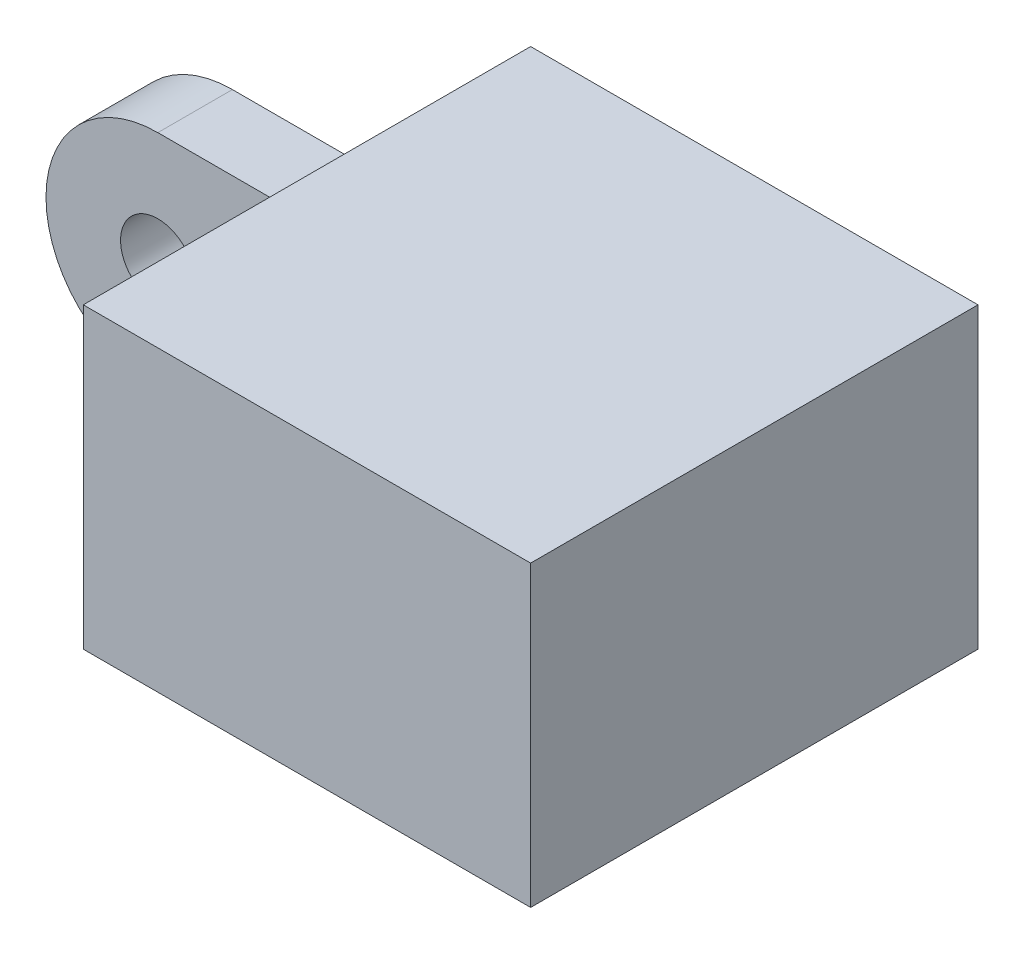
ISO-10303-21;
HEADER;
FILE_DESCRIPTION(('STEP AP214'),'2;1');
FILE_NAME('part.step','',(''),(''),'','','');
FILE_SCHEMA(('AUTOMOTIVE_DESIGN { 1 0 10303 214 1 1 1 1 }'));
ENDSEC;
DATA;
#1=APPLICATION_CONTEXT('core data for automotive mechanical design processes');
#2=APPLICATION_PROTOCOL_DEFINITION('international standard','automotive_design',2000,#1);
#3=PRODUCT_CONTEXT('',#1,'mechanical');
#4=PRODUCT('Part','Part','',(#3));
#5=PRODUCT_RELATED_PRODUCT_CATEGORY('part','',(#4));
#6=PRODUCT_DEFINITION_FORMATION('','',#4);
#7=PRODUCT_DEFINITION_CONTEXT('part definition',#1,'design');
#8=PRODUCT_DEFINITION('design','',#6,#7);
#9=PRODUCT_DEFINITION_SHAPE('','',#8);
#10=(LENGTH_UNIT() NAMED_UNIT(*) SI_UNIT(.MILLI.,.METRE.));
#11=(NAMED_UNIT(*) PLANE_ANGLE_UNIT() SI_UNIT($,.RADIAN.));
#12=(NAMED_UNIT(*) SI_UNIT($,.STERADIAN.) SOLID_ANGLE_UNIT());
#13=UNCERTAINTY_MEASURE_WITH_UNIT(LENGTH_MEASURE(1.E-05),#10,'distance_accuracy_value','');
#14=(GEOMETRIC_REPRESENTATION_CONTEXT(3) GLOBAL_UNCERTAINTY_ASSIGNED_CONTEXT((#13)) GLOBAL_UNIT_ASSIGNED_CONTEXT((#10,
#11,#12)) REPRESENTATION_CONTEXT('',''));
#15=CARTESIAN_POINT('',(0.,0.,0.));
#16=DIRECTION('',(0.,0.,1.));
#17=DIRECTION('',(1.,0.,0.));
#18=AXIS2_PLACEMENT_3D('',#15,#16,#17);
#19=CARTESIAN_POINT('',(-50.,0.,0.));
#20=DIRECTION('',(0.,0.,1.));
#21=DIRECTION('',(1.,0.,0.));
#22=AXIS2_PLACEMENT_3D('',#19,#20,#21);
#23=PLANE('',#22);
#24=CARTESIAN_POINT('',(-50.,0.,0.));
#25=DIRECTION('',(0.,0.,1.));
#26=DIRECTION('',(1.,0.,0.));
#27=AXIS2_PLACEMENT_3D('',#24,#25,#26);
#28=CIRCLE('',#27,5.);
#29=CARTESIAN_POINT('',(-45.,0.,0.));
#30=VERTEX_POINT('',#29);
#31=EDGE_CURVE('E149',#30,#30,#28,.T.);
#32=ORIENTED_EDGE('',*,*,#31,.T.);
#33=EDGE_LOOP('',(#32));
#34=FACE_BOUND('',#33,.T.);
#35=DIRECTION('',(0.,1.,0.));
#36=VECTOR('',#35,1.);
#37=CARTESIAN_POINT('',(-30.,-20.,0.));
#38=LINE('',#37,#36);
#39=CARTESIAN_POINT('',(-30.,-15.,0.));
#40=VERTEX_POINT('',#39);
#41=CARTESIAN_POINT('',(-30.,15.,0.));
#42=VERTEX_POINT('',#41);
#43=EDGE_CURVE('E11',#40,#42,#38,.T.);
#44=ORIENTED_EDGE('',*,*,#43,.F.);
#45=DIRECTION('',(1.,0.,0.));
#46=VECTOR('',#45,1.);
#47=CARTESIAN_POINT('',(-50.,-15.,0.));
#48=LINE('',#47,#46);
#49=CARTESIAN_POINT('',(-50.,-15.,0.));
#50=VERTEX_POINT('',#49);
#51=EDGE_CURVE('E159',#50,#40,#48,.T.);
#52=ORIENTED_EDGE('',*,*,#51,.F.);
#53=CARTESIAN_POINT('',(-50.,0.,0.));
#54=DIRECTION('',(0.,0.,1.));
#55=DIRECTION('',(1.,0.,0.));
#56=AXIS2_PLACEMENT_3D('',#53,#54,#55);
#57=CIRCLE('',#56,15.);
#58=CARTESIAN_POINT('',(-50.,15.,0.));
#59=VERTEX_POINT('',#58);
#60=EDGE_CURVE('E79',#59,#50,#57,.T.);
#61=ORIENTED_EDGE('',*,*,#60,.F.);
#62=DIRECTION('',(-1.,0.,0.));
#63=VECTOR('',#62,1.);
#64=CARTESIAN_POINT('',(-50.,15.,0.));
#65=LINE('',#64,#63);
#66=EDGE_CURVE('E72',#42,#59,#65,.T.);
#67=ORIENTED_EDGE('',*,*,#66,.F.);
#68=EDGE_LOOP('',(#44,#52,#61,#67));
#69=FACE_BOUND('',#68,.T.);
#70=ADVANCED_FACE('F39',(#34,#69),#23,.F.);
#71=CARTESIAN_POINT('',(-50.,0.,10.));
#72=DIRECTION('',(0.,0.,1.));
#73=DIRECTION('',(1.,0.,0.));
#74=AXIS2_PLACEMENT_3D('',#71,#72,#73);
#75=PLANE('',#74);
#76=DIRECTION('',(0.,-1.,0.));
#77=VECTOR('',#76,1.);
#78=CARTESIAN_POINT('',(-30.,20.,10.));
#79=LINE('',#78,#77);
#80=CARTESIAN_POINT('',(-30.,15.,10.));
#81=VERTEX_POINT('',#80);
#82=CARTESIAN_POINT('',(-30.,-15.,10.));
#83=VERTEX_POINT('',#82);
#84=EDGE_CURVE('E49',#81,#83,#79,.T.);
#85=ORIENTED_EDGE('',*,*,#84,.F.);
#86=DIRECTION('',(-1.,0.,0.));
#87=VECTOR('',#86,1.);
#88=CARTESIAN_POINT('',(-50.,15.,10.));
#89=LINE('',#88,#87);
#90=CARTESIAN_POINT('',(-50.,15.,10.));
#91=VERTEX_POINT('',#90);
#92=EDGE_CURVE('E156',#81,#91,#89,.T.);
#93=ORIENTED_EDGE('',*,*,#92,.T.);
#94=CARTESIAN_POINT('',(-50.,0.,10.));
#95=DIRECTION('',(0.,0.,1.));
#96=DIRECTION('',(1.,0.,0.));
#97=AXIS2_PLACEMENT_3D('',#94,#95,#96);
#98=CIRCLE('',#97,15.);
#99=CARTESIAN_POINT('',(-50.,-15.,10.));
#100=VERTEX_POINT('',#99);
#101=EDGE_CURVE('E158',#91,#100,#98,.T.);
#102=ORIENTED_EDGE('',*,*,#101,.T.);
#103=DIRECTION('',(1.,0.,0.));
#104=VECTOR('',#103,1.);
#105=CARTESIAN_POINT('',(-50.,-15.,10.));
#106=LINE('',#105,#104);
#107=EDGE_CURVE('E58',#100,#83,#106,.T.);
#108=ORIENTED_EDGE('',*,*,#107,.T.);
#109=EDGE_LOOP('',(#85,#93,#102,#108));
#110=FACE_BOUND('',#109,.T.);
#111=CARTESIAN_POINT('',(-50.,0.,10.));
#112=DIRECTION('',(0.,0.,1.));
#113=DIRECTION('',(1.,0.,0.));
#114=AXIS2_PLACEMENT_3D('',#111,#112,#113);
#115=CIRCLE('',#114,5.);
#116=CARTESIAN_POINT('',(-45.,0.,10.));
#117=VERTEX_POINT('',#116);
#118=EDGE_CURVE('E151',#117,#117,#115,.T.);
#119=ORIENTED_EDGE('',*,*,#118,.F.);
#120=EDGE_LOOP('',(#119));
#121=FACE_BOUND('',#120,.T.);
#122=ADVANCED_FACE('F199',(#110,#121),#75,.T.);
#123=CARTESIAN_POINT('',(30.,20.,10.));
#124=DIRECTION('',(-1.,0.,0.));
#125=DIRECTION('',(0.,-1.,0.));
#126=AXIS2_PLACEMENT_3D('',#123,#124,#125);
#127=PLANE('',#126);
#128=DIRECTION('',(0.,0.,-1.));
#129=VECTOR('',#128,1.);
#130=CARTESIAN_POINT('',(30.,-20.,10.));
#131=LINE('',#130,#129);
#132=CARTESIAN_POINT('',(30.,-20.,40.));
#133=VERTEX_POINT('',#132);
#134=CARTESIAN_POINT('',(30.,-20.,-20.));
#135=VERTEX_POINT('',#134);
#136=EDGE_CURVE('E126',#133,#135,#131,.T.);
#137=ORIENTED_EDGE('',*,*,#136,.T.);
#138=DIRECTION('',(0.,-1.,0.));
#139=VECTOR('',#138,1.);
#140=CARTESIAN_POINT('',(30.,20.,-20.));
#141=LINE('',#140,#139);
#142=CARTESIAN_POINT('',(30.,20.,-20.));
#143=VERTEX_POINT('',#142);
#144=EDGE_CURVE('E125',#143,#135,#141,.T.);
#145=ORIENTED_EDGE('',*,*,#144,.F.);
#146=DIRECTION('',(0.,0.,-1.));
#147=VECTOR('',#146,1.);
#148=CARTESIAN_POINT('',(30.,20.,10.));
#149=LINE('',#148,#147);
#150=CARTESIAN_POINT('',(30.,20.,40.));
#151=VERTEX_POINT('',#150);
#152=EDGE_CURVE('E43',#151,#143,#149,.T.);
#153=ORIENTED_EDGE('',*,*,#152,.F.);
#154=DIRECTION('',(0.,1.,0.));
#155=VECTOR('',#154,1.);
#156=CARTESIAN_POINT('',(30.,-20.,40.));
#157=LINE('',#156,#155);
#158=EDGE_CURVE('E147',#133,#151,#157,.T.);
#159=ORIENTED_EDGE('',*,*,#158,.F.);
#160=EDGE_LOOP('',(#137,#145,#153,#159));
#161=FACE_BOUND('',#160,.T.);
#162=ADVANCED_FACE('F41',(#161),#127,.F.);
#163=CARTESIAN_POINT('',(-30.,20.,10.));
#164=DIRECTION('',(0.,-1.,0.));
#165=DIRECTION('',(0.,0.,-1.));
#166=AXIS2_PLACEMENT_3D('',#163,#164,#165);
#167=PLANE('',#166);
#168=ORIENTED_EDGE('',*,*,#152,.T.);
#169=DIRECTION('',(1.,0.,0.));
#170=VECTOR('',#169,1.);
#171=CARTESIAN_POINT('',(-30.,20.,-20.));
#172=LINE('',#171,#170);
#173=CARTESIAN_POINT('',(-30.,20.,-20.));
#174=VERTEX_POINT('',#173);
#175=EDGE_CURVE('E117',#174,#143,#172,.T.);
#176=ORIENTED_EDGE('',*,*,#175,.F.);
#177=DIRECTION('',(0.,0.,-1.));
#178=VECTOR('',#177,1.);
#179=CARTESIAN_POINT('',(-30.,20.,10.));
#180=LINE('',#179,#178);
#181=CARTESIAN_POINT('',(-30.,20.,40.));
#182=VERTEX_POINT('',#181);
#183=EDGE_CURVE('E123',#182,#174,#180,.T.);
#184=ORIENTED_EDGE('',*,*,#183,.F.);
#185=DIRECTION('',(-1.,0.,0.));
#186=VECTOR('',#185,1.);
#187=CARTESIAN_POINT('',(30.,20.,40.));
#188=LINE('',#187,#186);
#189=EDGE_CURVE('E119',#151,#182,#188,.T.);
#190=ORIENTED_EDGE('',*,*,#189,.F.);
#191=EDGE_LOOP('',(#168,#176,#184,#190));
#192=FACE_BOUND('',#191,.T.);
#193=ADVANCED_FACE('F115',(#192),#167,.F.);
#194=CARTESIAN_POINT('',(-50.,15.,10.));
#195=DIRECTION('',(0.,-1.,0.));
#196=DIRECTION('',(0.,0.,-1.));
#197=AXIS2_PLACEMENT_3D('',#194,#195,#196);
#198=PLANE('',#197);
#199=ORIENTED_EDGE('',*,*,#66,.T.);
#200=DIRECTION('',(0.,0.,-1.));
#201=VECTOR('',#200,1.);
#202=CARTESIAN_POINT('',(-50.,15.,10.));
#203=LINE('',#202,#201);
#204=EDGE_CURVE('E174',#91,#59,#203,.T.);
#205=ORIENTED_EDGE('',*,*,#204,.F.);
#206=ORIENTED_EDGE('',*,*,#92,.F.);
#207=DIRECTION('',(0.,0.,-1.));
#208=VECTOR('',#207,1.);
#209=CARTESIAN_POINT('',(-30.,15.,10.));
#210=LINE('',#209,#208);
#211=EDGE_CURVE('E176',#81,#42,#210,.T.);
#212=ORIENTED_EDGE('',*,*,#211,.T.);
#213=EDGE_LOOP('',(#199,#205,#206,#212));
#214=FACE_BOUND('',#213,.T.);
#215=ADVANCED_FACE('F247',(#214),#198,.F.);
#216=CARTESIAN_POINT('',(-50.,0.,10.));
#217=DIRECTION('',(0.,0.,-1.));
#218=DIRECTION('',(-1.,0.,0.));
#219=AXIS2_PLACEMENT_3D('',#216,#217,#218);
#220=CYLINDRICAL_SURFACE('',#219,15.);
#221=ORIENTED_EDGE('',*,*,#60,.T.);
#222=DIRECTION('',(0.,0.,-1.));
#223=VECTOR('',#222,1.);
#224=CARTESIAN_POINT('',(-50.,-15.,10.));
#225=LINE('',#224,#223);
#226=EDGE_CURVE('E172',#100,#50,#225,.T.);
#227=ORIENTED_EDGE('',*,*,#226,.F.);
#228=ORIENTED_EDGE('',*,*,#101,.F.);
#229=ORIENTED_EDGE('',*,*,#204,.T.);
#230=EDGE_LOOP('',(#221,#227,#228,#229));
#231=FACE_BOUND('',#230,.T.);
#232=ADVANCED_FACE('F228',(#231),#220,.T.);
#233=CARTESIAN_POINT('',(-50.,-15.,10.));
#234=DIRECTION('',(0.,1.,0.));
#235=DIRECTION('',(-1.,0.,0.));
#236=AXIS2_PLACEMENT_3D('',#233,#234,#235);
#237=PLANE('',#236);
#238=ORIENTED_EDGE('',*,*,#51,.T.);
#239=DIRECTION('',(0.,0.,-1.));
#240=VECTOR('',#239,1.);
#241=CARTESIAN_POINT('',(-30.,-15.,10.));
#242=LINE('',#241,#240);
#243=EDGE_CURVE('E169',#83,#40,#242,.T.);
#244=ORIENTED_EDGE('',*,*,#243,.F.);
#245=ORIENTED_EDGE('',*,*,#107,.F.);
#246=ORIENTED_EDGE('',*,*,#226,.T.);
#247=EDGE_LOOP('',(#238,#244,#245,#246));
#248=FACE_BOUND('',#247,.T.);
#249=ADVANCED_FACE('F195',(#248),#237,.F.);
#250=CARTESIAN_POINT('',(-30.,-15.,10.));
#251=DIRECTION('',(1.,0.,0.));
#252=DIRECTION('',(0.,0.,-1.));
#253=AXIS2_PLACEMENT_3D('',#250,#251,#252);
#254=PLANE('',#253);
#255=DIRECTION('',(0.,1.,0.));
#256=VECTOR('',#255,1.);
#257=CARTESIAN_POINT('',(-30.,-20.,-20.));
#258=LINE('',#257,#256);
#259=CARTESIAN_POINT('',(-30.,-20.,-20.));
#260=VERTEX_POINT('',#259);
#261=EDGE_CURVE('E135',#260,#174,#258,.T.);
#262=ORIENTED_EDGE('',*,*,#261,.F.);
#263=DIRECTION('',(0.,0.,-1.));
#264=VECTOR('',#263,1.);
#265=CARTESIAN_POINT('',(-30.,-20.,10.));
#266=LINE('',#265,#264);
#267=CARTESIAN_POINT('',(-30.,-20.,40.));
#268=VERTEX_POINT('',#267);
#269=EDGE_CURVE('E167',#268,#260,#266,.T.);
#270=ORIENTED_EDGE('',*,*,#269,.F.);
#271=DIRECTION('',(0.,-1.,0.));
#272=VECTOR('',#271,1.);
#273=CARTESIAN_POINT('',(-30.,20.,40.));
#274=LINE('',#273,#272);
#275=EDGE_CURVE('E141',#182,#268,#274,.T.);
#276=ORIENTED_EDGE('',*,*,#275,.F.);
#277=ORIENTED_EDGE('',*,*,#183,.T.);
#278=EDGE_LOOP('',(#262,#270,#276,#277));
#279=FACE_BOUND('',#278,.T.);
#280=ORIENTED_EDGE('',*,*,#243,.T.);
#281=ORIENTED_EDGE('',*,*,#43,.T.);
#282=ORIENTED_EDGE('',*,*,#211,.F.);
#283=ORIENTED_EDGE('',*,*,#84,.T.);
#284=EDGE_LOOP('',(#280,#281,#282,#283));
#285=FACE_BOUND('',#284,.T.);
#286=ADVANCED_FACE('F179',(#279,#285),#254,.F.);
#287=CARTESIAN_POINT('',(-30.,-20.,10.));
#288=DIRECTION('',(0.,1.,0.));
#289=DIRECTION('',(0.,0.,1.));
#290=AXIS2_PLACEMENT_3D('',#287,#288,#289);
#291=PLANE('',#290);
#292=ORIENTED_EDGE('',*,*,#269,.T.);
#293=DIRECTION('',(-1.,0.,0.));
#294=VECTOR('',#293,1.);
#295=CARTESIAN_POINT('',(30.,-20.,-20.));
#296=LINE('',#295,#294);
#297=EDGE_CURVE('E130',#135,#260,#296,.T.);
#298=ORIENTED_EDGE('',*,*,#297,.F.);
#299=ORIENTED_EDGE('',*,*,#136,.F.);
#300=DIRECTION('',(1.,0.,0.));
#301=VECTOR('',#300,1.);
#302=CARTESIAN_POINT('',(-30.,-20.,40.));
#303=LINE('',#302,#301);
#304=EDGE_CURVE('E144',#268,#133,#303,.T.);
#305=ORIENTED_EDGE('',*,*,#304,.F.);
#306=EDGE_LOOP('',(#292,#298,#299,#305));
#307=FACE_BOUND('',#306,.T.);
#308=ADVANCED_FACE('F185',(#307),#291,.F.);
#309=CARTESIAN_POINT('',(-50.,0.,10.));
#310=DIRECTION('',(0.,0.,-1.));
#311=DIRECTION('',(-1.,0.,0.));
#312=AXIS2_PLACEMENT_3D('',#309,#310,#311);
#313=CYLINDRICAL_SURFACE('',#312,5.);
#314=ORIENTED_EDGE('',*,*,#118,.T.);
#315=EDGE_LOOP('',(#314));
#316=FACE_BOUND('',#315,.T.);
#317=ORIENTED_EDGE('',*,*,#31,.F.);
#318=EDGE_LOOP('',(#317));
#319=FACE_BOUND('',#318,.T.);
#320=ADVANCED_FACE('F187',(#316,#319),#313,.F.);
#321=CARTESIAN_POINT('',(0.,0.,40.));
#322=DIRECTION('',(0.,0.,1.));
#323=DIRECTION('',(1.,0.,0.));
#324=AXIS2_PLACEMENT_3D('',#321,#322,#323);
#325=PLANE('',#324);
#326=ORIENTED_EDGE('',*,*,#189,.T.);
#327=ORIENTED_EDGE('',*,*,#275,.T.);
#328=ORIENTED_EDGE('',*,*,#304,.T.);
#329=ORIENTED_EDGE('',*,*,#158,.T.);
#330=EDGE_LOOP('',(#326,#327,#328,#329));
#331=FACE_BOUND('',#330,.T.);
#332=ADVANCED_FACE('F183',(#331),#325,.T.);
#333=CARTESIAN_POINT('',(0.,0.,-20.));
#334=DIRECTION('',(0.,0.,-1.));
#335=DIRECTION('',(-1.,0.,0.));
#336=AXIS2_PLACEMENT_3D('',#333,#334,#335);
#337=PLANE('',#336);
#338=ORIENTED_EDGE('',*,*,#175,.T.);
#339=ORIENTED_EDGE('',*,*,#144,.T.);
#340=ORIENTED_EDGE('',*,*,#297,.T.);
#341=ORIENTED_EDGE('',*,*,#261,.T.);
#342=EDGE_LOOP('',(#338,#339,#340,#341));
#343=FACE_BOUND('',#342,.T.);
#344=ADVANCED_FACE('F133',(#343),#337,.T.);
#345=CLOSED_SHELL('',(#70,#122,#162,#193,#215,#232,#249,#286,#308,#320,#332,#344));
#346=MANIFOLD_SOLID_BREP('B2',#345);
#347=ADVANCED_BREP_SHAPE_REPRESENTATION('',(#18,#346),#14);
#348=SHAPE_DEFINITION_REPRESENTATION(#9,#347);
ENDSEC;
END-ISO-10303-21;
